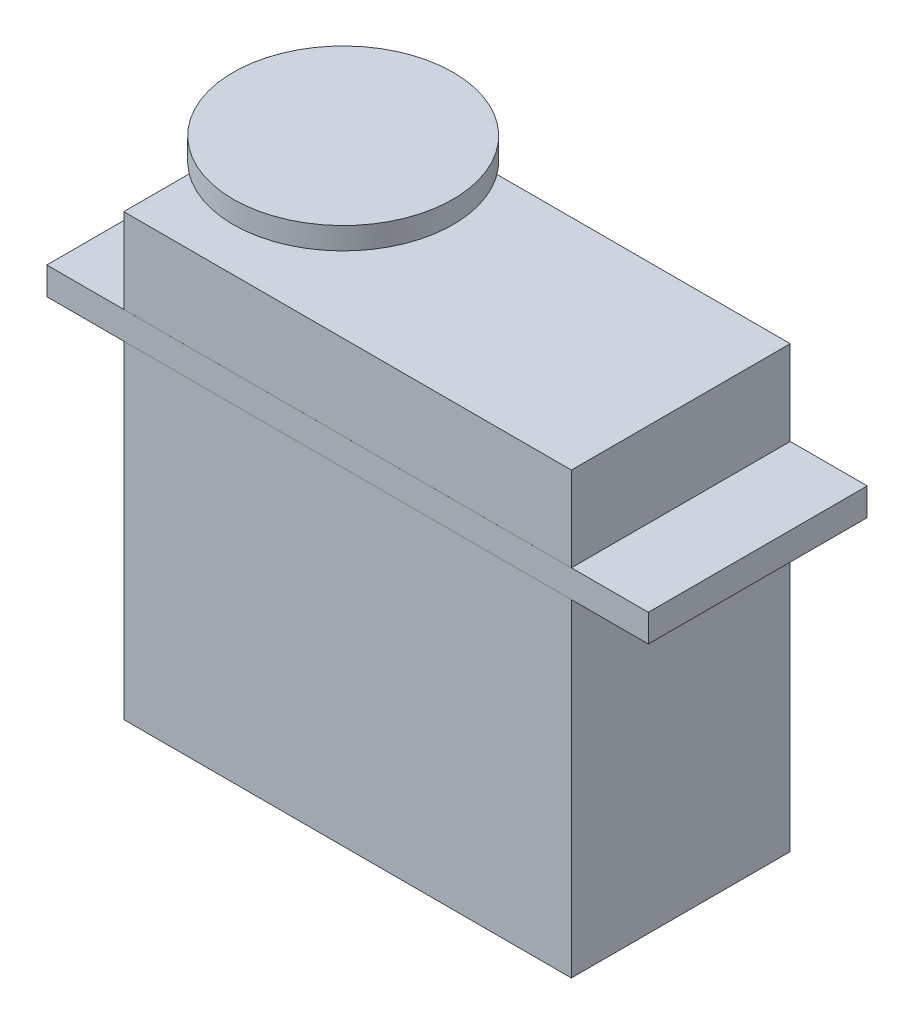
ISO-10303-21;
HEADER;
FILE_DESCRIPTION(('STEP AP214'),'2;1');
FILE_NAME('part.step','',(''),(''),'','','');
FILE_SCHEMA(('AUTOMOTIVE_DESIGN { 1 0 10303 214 1 1 1 1 }'));
ENDSEC;
DATA;
#1=APPLICATION_CONTEXT('core data for automotive mechanical design processes');
#2=APPLICATION_PROTOCOL_DEFINITION('international standard','automotive_design',2000,#1);
#3=PRODUCT_CONTEXT('',#1,'mechanical');
#4=PRODUCT('Part','Part','',(#3));
#5=PRODUCT_RELATED_PRODUCT_CATEGORY('part','',(#4));
#6=PRODUCT_DEFINITION_FORMATION('','',#4);
#7=PRODUCT_DEFINITION_CONTEXT('part definition',#1,'design');
#8=PRODUCT_DEFINITION('design','',#6,#7);
#9=PRODUCT_DEFINITION_SHAPE('','',#8);
#10=(LENGTH_UNIT() NAMED_UNIT(*) SI_UNIT(.MILLI.,.METRE.));
#11=(NAMED_UNIT(*) PLANE_ANGLE_UNIT() SI_UNIT($,.RADIAN.));
#12=(NAMED_UNIT(*) SI_UNIT($,.STERADIAN.) SOLID_ANGLE_UNIT());
#13=UNCERTAINTY_MEASURE_WITH_UNIT(LENGTH_MEASURE(1.E-05),#10,'distance_accuracy_value','');
#14=(GEOMETRIC_REPRESENTATION_CONTEXT(3) GLOBAL_UNCERTAINTY_ASSIGNED_CONTEXT((#13)) GLOBAL_UNIT_ASSIGNED_CONTEXT((#10,
#11,#12)) REPRESENTATION_CONTEXT('',''));
#15=CARTESIAN_POINT('',(0.,0.,0.));
#16=DIRECTION('',(0.,0.,1.));
#17=DIRECTION('',(1.,0.,0.));
#18=AXIS2_PLACEMENT_3D('',#15,#16,#17);
#19=CARTESIAN_POINT('',(-10.35,46.,0.));
#20=DIRECTION('',(0.,-1.,0.));
#21=DIRECTION('',(0.,0.,-1.));
#22=AXIS2_PLACEMENT_3D('',#19,#20,#21);
#23=CYLINDRICAL_SURFACE('',#22,3.);
#24=CARTESIAN_POINT('',(-10.35,40.,0.));
#25=DIRECTION('',(0.,1.,0.));
#26=DIRECTION('',(0.,0.,1.));
#27=AXIS2_PLACEMENT_3D('',#24,#25,#26);
#28=CIRCLE('',#27,3.);
#29=CARTESIAN_POINT('',(-10.35,40.,3.));
#30=VERTEX_POINT('',#29);
#31=EDGE_CURVE('E186',#30,#30,#28,.T.);
#32=ORIENTED_EDGE('',*,*,#31,.T.);
#33=EDGE_LOOP('',(#32));
#34=FACE_BOUND('',#33,.T.);
#35=CARTESIAN_POINT('',(-10.35,44.,0.));
#36=DIRECTION('',(0.,1.,0.));
#37=DIRECTION('',(0.,0.,1.));
#38=AXIS2_PLACEMENT_3D('',#35,#36,#37);
#39=CIRCLE('',#38,3.);
#40=CARTESIAN_POINT('',(-10.35,44.,3.));
#41=VERTEX_POINT('',#40);
#42=EDGE_CURVE('E11',#41,#41,#39,.T.);
#43=ORIENTED_EDGE('',*,*,#42,.F.);
#44=EDGE_LOOP('',(#43));
#45=FACE_BOUND('',#44,.T.);
#46=ADVANCED_FACE('F35',(#34,#45),#23,.T.);
#47=CARTESIAN_POINT('',(20.35,40.,-9.95));
#48=DIRECTION('',(-1.,0.,0.));
#49=DIRECTION('',(0.,0.,1.));
#50=AXIS2_PLACEMENT_3D('',#47,#48,#49);
#51=PLANE('',#50);
#52=DIRECTION('',(0.,-1.,0.));
#53=VECTOR('',#52,1.);
#54=CARTESIAN_POINT('',(20.35,40.,9.95));
#55=LINE('',#54,#53);
#56=CARTESIAN_POINT('',(20.35,40.,9.95));
#57=VERTEX_POINT('',#56);
#58=CARTESIAN_POINT('',(20.35,32.3,9.95));
#59=VERTEX_POINT('',#58);
#60=EDGE_CURVE('E211',#57,#59,#55,.T.);
#61=ORIENTED_EDGE('',*,*,#60,.T.);
#62=DIRECTION('',(0.,0.,-1.));
#63=VECTOR('',#62,1.);
#64=CARTESIAN_POINT('',(20.35,32.3,-9.95));
#65=LINE('',#64,#63);
#66=CARTESIAN_POINT('',(20.35,32.3,-9.95));
#67=VERTEX_POINT('',#66);
#68=EDGE_CURVE('E178',#59,#67,#65,.T.);
#69=ORIENTED_EDGE('',*,*,#68,.T.);
#70=DIRECTION('',(0.,-1.,0.));
#71=VECTOR('',#70,1.);
#72=CARTESIAN_POINT('',(20.35,40.,-9.95));
#73=LINE('',#72,#71);
#74=CARTESIAN_POINT('',(20.35,40.,-9.95));
#75=VERTEX_POINT('',#74);
#76=EDGE_CURVE('E223',#75,#67,#73,.T.);
#77=ORIENTED_EDGE('',*,*,#76,.F.);
#78=DIRECTION('',(0.,0.,-1.));
#79=VECTOR('',#78,1.);
#80=CARTESIAN_POINT('',(20.35,40.,-9.95));
#81=LINE('',#80,#79);
#82=EDGE_CURVE('E190',#57,#75,#81,.T.);
#83=ORIENTED_EDGE('',*,*,#82,.F.);
#84=EDGE_LOOP('',(#61,#69,#77,#83));
#85=FACE_BOUND('',#84,.T.);
#86=ADVANCED_FACE('F37',(#85),#51,.F.);
#87=CARTESIAN_POINT('',(-20.35,40.,-9.95));
#88=DIRECTION('',(0.,0.,1.));
#89=DIRECTION('',(1.,0.,0.));
#90=AXIS2_PLACEMENT_3D('',#87,#88,#89);
#91=PLANE('',#90);
#92=ORIENTED_EDGE('',*,*,#76,.T.);
#93=DIRECTION('',(-1.,0.,0.));
#94=VECTOR('',#93,1.);
#95=CARTESIAN_POINT('',(-20.35,32.3,-9.95));
#96=LINE('',#95,#94);
#97=CARTESIAN_POINT('',(-20.35,32.3,-9.95));
#98=VERTEX_POINT('',#97);
#99=EDGE_CURVE('E175',#67,#98,#96,.T.);
#100=ORIENTED_EDGE('',*,*,#99,.T.);
#101=DIRECTION('',(0.,-1.,0.));
#102=VECTOR('',#101,1.);
#103=CARTESIAN_POINT('',(-20.35,40.,-9.95));
#104=LINE('',#103,#102);
#105=CARTESIAN_POINT('',(-20.35,40.,-9.95));
#106=VERTEX_POINT('',#105);
#107=EDGE_CURVE('E219',#106,#98,#104,.T.);
#108=ORIENTED_EDGE('',*,*,#107,.F.);
#109=DIRECTION('',(-1.,0.,0.));
#110=VECTOR('',#109,1.);
#111=CARTESIAN_POINT('',(-20.35,40.,-9.95));
#112=LINE('',#111,#110);
#113=EDGE_CURVE('E193',#75,#106,#112,.T.);
#114=ORIENTED_EDGE('',*,*,#113,.F.);
#115=EDGE_LOOP('',(#92,#100,#108,#114));
#116=FACE_BOUND('',#115,.T.);
#117=ADVANCED_FACE('F243',(#116),#91,.F.);
#118=CARTESIAN_POINT('',(-20.35,40.,-9.95));
#119=DIRECTION('',(1.,0.,0.));
#120=DIRECTION('',(0.,0.,-1.));
#121=AXIS2_PLACEMENT_3D('',#118,#119,#120);
#122=PLANE('',#121);
#123=ORIENTED_EDGE('',*,*,#107,.T.);
#124=DIRECTION('',(0.,0.,1.));
#125=VECTOR('',#124,1.);
#126=CARTESIAN_POINT('',(-20.35,32.3,-9.95));
#127=LINE('',#126,#125);
#128=CARTESIAN_POINT('',(-20.35,32.3,9.95));
#129=VERTEX_POINT('',#128);
#130=EDGE_CURVE('E169',#98,#129,#127,.T.);
#131=ORIENTED_EDGE('',*,*,#130,.T.);
#132=DIRECTION('',(0.,-1.,0.));
#133=VECTOR('',#132,1.);
#134=CARTESIAN_POINT('',(-20.35,40.,9.95));
#135=LINE('',#134,#133);
#136=CARTESIAN_POINT('',(-20.35,40.,9.95));
#137=VERTEX_POINT('',#136);
#138=EDGE_CURVE('E215',#137,#129,#135,.T.);
#139=ORIENTED_EDGE('',*,*,#138,.F.);
#140=DIRECTION('',(0.,0.,1.));
#141=VECTOR('',#140,1.);
#142=CARTESIAN_POINT('',(-20.35,40.,-9.95));
#143=LINE('',#142,#141);
#144=EDGE_CURVE('E196',#106,#137,#143,.T.);
#145=ORIENTED_EDGE('',*,*,#144,.F.);
#146=EDGE_LOOP('',(#123,#131,#139,#145));
#147=FACE_BOUND('',#146,.T.);
#148=ADVANCED_FACE('F250',(#147),#122,.F.);
#149=CARTESIAN_POINT('',(-20.35,40.,9.95));
#150=DIRECTION('',(0.,0.,-1.));
#151=DIRECTION('',(-1.,0.,0.));
#152=AXIS2_PLACEMENT_3D('',#149,#150,#151);
#153=PLANE('',#152);
#154=ORIENTED_EDGE('',*,*,#138,.T.);
#155=DIRECTION('',(1.,0.,0.));
#156=VECTOR('',#155,1.);
#157=CARTESIAN_POINT('',(-20.35,32.3,9.95));
#158=LINE('',#157,#156);
#159=EDGE_CURVE('E226',#129,#59,#158,.T.);
#160=ORIENTED_EDGE('',*,*,#159,.T.);
#161=ORIENTED_EDGE('',*,*,#60,.F.);
#162=DIRECTION('',(1.,0.,0.));
#163=VECTOR('',#162,1.);
#164=CARTESIAN_POINT('',(-20.35,40.,9.95));
#165=LINE('',#164,#163);
#166=EDGE_CURVE('E198',#137,#57,#165,.T.);
#167=ORIENTED_EDGE('',*,*,#166,.F.);
#168=EDGE_LOOP('',(#154,#160,#161,#167));
#169=FACE_BOUND('',#168,.T.);
#170=ADVANCED_FACE('F268',(#169),#153,.F.);
#171=CARTESIAN_POINT('',(0.,40.,0.));
#172=DIRECTION('',(0.,1.,0.));
#173=DIRECTION('',(0.,0.,1.));
#174=AXIS2_PLACEMENT_3D('',#171,#172,#173);
#175=PLANE('',#174);
#176=ORIENTED_EDGE('',*,*,#31,.F.);
#177=EDGE_LOOP('',(#176));
#178=FACE_BOUND('',#177,.T.);
#179=ORIENTED_EDGE('',*,*,#82,.T.);
#180=ORIENTED_EDGE('',*,*,#113,.T.);
#181=ORIENTED_EDGE('',*,*,#144,.T.);
#182=ORIENTED_EDGE('',*,*,#166,.T.);
#183=EDGE_LOOP('',(#179,#180,#181,#182));
#184=FACE_BOUND('',#183,.T.);
#185=ADVANCED_FACE('F265',(#178,#184),#175,.T.);
#186=CARTESIAN_POINT('',(0.,29.8,0.));
#187=DIRECTION('',(0.,1.,0.));
#188=DIRECTION('',(0.,0.,1.));
#189=AXIS2_PLACEMENT_3D('',#186,#187,#188);
#190=PLANE('',#189);
#191=DIRECTION('',(0.,0.,1.));
#192=VECTOR('',#191,1.);
#193=CARTESIAN_POINT('',(-27.35,29.8,9.95061520725891));
#194=LINE('',#193,#192);
#195=CARTESIAN_POINT('',(-27.35,29.8,-9.95061520725891));
#196=VERTEX_POINT('',#195);
#197=CARTESIAN_POINT('',(-27.35,29.8,9.95061520725891));
#198=VERTEX_POINT('',#197);
#199=EDGE_CURVE('E144',#196,#198,#194,.T.);
#200=ORIENTED_EDGE('',*,*,#199,.F.);
#201=DIRECTION('',(-1.,0.,0.));
#202=VECTOR('',#201,1.);
#203=CARTESIAN_POINT('',(27.35,29.8,-9.95061520725891));
#204=LINE('',#203,#202);
#205=CARTESIAN_POINT('',(27.35,29.8,-9.95061520725891));
#206=VERTEX_POINT('',#205);
#207=EDGE_CURVE('E136',#206,#196,#204,.T.);
#208=ORIENTED_EDGE('',*,*,#207,.F.);
#209=DIRECTION('',(0.,0.,-1.));
#210=VECTOR('',#209,1.);
#211=CARTESIAN_POINT('',(27.35,29.8,9.95061520725891));
#212=LINE('',#211,#210);
#213=CARTESIAN_POINT('',(27.35,29.8,9.95061520725891));
#214=VERTEX_POINT('',#213);
#215=EDGE_CURVE('E147',#214,#206,#212,.T.);
#216=ORIENTED_EDGE('',*,*,#215,.F.);
#217=DIRECTION('',(1.,0.,0.));
#218=VECTOR('',#217,1.);
#219=CARTESIAN_POINT('',(27.35,29.8,9.95061520725891));
#220=LINE('',#219,#218);
#221=EDGE_CURVE('E128',#198,#214,#220,.T.);
#222=ORIENTED_EDGE('',*,*,#221,.F.);
#223=EDGE_LOOP('',(#200,#208,#216,#222));
#224=FACE_BOUND('',#223,.T.);
#225=DIRECTION('',(1.,0.,0.));
#226=VECTOR('',#225,1.);
#227=CARTESIAN_POINT('',(-20.35,29.8,9.95));
#228=LINE('',#227,#226);
#229=CARTESIAN_POINT('',(-20.35,29.8,9.95));
#230=VERTEX_POINT('',#229);
#231=CARTESIAN_POINT('',(20.35,29.8,9.95));
#232=VERTEX_POINT('',#231);
#233=EDGE_CURVE('E43',#230,#232,#228,.T.);
#234=ORIENTED_EDGE('',*,*,#233,.T.);
#235=DIRECTION('',(0.,0.,-1.));
#236=VECTOR('',#235,1.);
#237=CARTESIAN_POINT('',(20.35,29.8,-9.95));
#238=LINE('',#237,#236);
#239=CARTESIAN_POINT('',(20.35,29.8,-9.95));
#240=VERTEX_POINT('',#239);
#241=EDGE_CURVE('E183',#232,#240,#238,.T.);
#242=ORIENTED_EDGE('',*,*,#241,.T.);
#243=DIRECTION('',(-1.,0.,0.));
#244=VECTOR('',#243,1.);
#245=CARTESIAN_POINT('',(-20.35,29.8,-9.95));
#246=LINE('',#245,#244);
#247=CARTESIAN_POINT('',(-20.35,29.8,-9.95));
#248=VERTEX_POINT('',#247);
#249=EDGE_CURVE('E50',#240,#248,#246,.T.);
#250=ORIENTED_EDGE('',*,*,#249,.T.);
#251=DIRECTION('',(0.,0.,1.));
#252=VECTOR('',#251,1.);
#253=CARTESIAN_POINT('',(-20.35,29.8,-9.95));
#254=LINE('',#253,#252);
#255=EDGE_CURVE('E58',#248,#230,#254,.T.);
#256=ORIENTED_EDGE('',*,*,#255,.T.);
#257=EDGE_LOOP('',(#234,#242,#250,#256));
#258=FACE_BOUND('',#257,.T.);
#259=ADVANCED_FACE('F141',(#224,#258),#190,.F.);
#260=CARTESIAN_POINT('',(0.,32.3,0.));
#261=DIRECTION('',(0.,1.,0.));
#262=DIRECTION('',(0.,0.,1.));
#263=AXIS2_PLACEMENT_3D('',#260,#261,#262);
#264=PLANE('',#263);
#265=DIRECTION('',(0.,0.,1.));
#266=VECTOR('',#265,1.);
#267=CARTESIAN_POINT('',(-27.35,32.3,9.95061520725891));
#268=LINE('',#267,#266);
#269=CARTESIAN_POINT('',(-27.35,32.3,-9.95061520725891));
#270=VERTEX_POINT('',#269);
#271=CARTESIAN_POINT('',(-27.35,32.3,9.95061520725891));
#272=VERTEX_POINT('',#271);
#273=EDGE_CURVE('E162',#270,#272,#268,.T.);
#274=ORIENTED_EDGE('',*,*,#273,.T.);
#275=DIRECTION('',(1.,0.,0.));
#276=VECTOR('',#275,1.);
#277=CARTESIAN_POINT('',(27.35,32.3,9.95061520725891));
#278=LINE('',#277,#276);
#279=CARTESIAN_POINT('',(27.35,32.3,9.95061520725891));
#280=VERTEX_POINT('',#279);
#281=EDGE_CURVE('E130',#272,#280,#278,.T.);
#282=ORIENTED_EDGE('',*,*,#281,.T.);
#283=DIRECTION('',(0.,0.,-1.));
#284=VECTOR('',#283,1.);
#285=CARTESIAN_POINT('',(27.35,32.3,9.95061520725891));
#286=LINE('',#285,#284);
#287=CARTESIAN_POINT('',(27.35,32.3,-9.95061520725891));
#288=VERTEX_POINT('',#287);
#289=EDGE_CURVE('E154',#280,#288,#286,.T.);
#290=ORIENTED_EDGE('',*,*,#289,.T.);
#291=DIRECTION('',(-1.,0.,0.));
#292=VECTOR('',#291,1.);
#293=CARTESIAN_POINT('',(27.35,32.3,-9.95061520725891));
#294=LINE('',#293,#292);
#295=EDGE_CURVE('E151',#288,#270,#294,.T.);
#296=ORIENTED_EDGE('',*,*,#295,.T.);
#297=EDGE_LOOP('',(#274,#282,#290,#296));
#298=FACE_BOUND('',#297,.T.);
#299=ORIENTED_EDGE('',*,*,#68,.F.);
#300=ORIENTED_EDGE('',*,*,#159,.F.);
#301=ORIENTED_EDGE('',*,*,#130,.F.);
#302=ORIENTED_EDGE('',*,*,#99,.F.);
#303=EDGE_LOOP('',(#299,#300,#301,#302));
#304=FACE_BOUND('',#303,.T.);
#305=ADVANCED_FACE('F283',(#298,#304),#264,.T.);
#306=CARTESIAN_POINT('',(-27.35,29.8,9.95061520725891));
#307=DIRECTION('',(-1.,0.,0.));
#308=DIRECTION('',(0.,0.,1.));
#309=AXIS2_PLACEMENT_3D('',#306,#307,#308);
#310=PLANE('',#309);
#311=ORIENTED_EDGE('',*,*,#273,.F.);
#312=DIRECTION('',(0.,1.,0.));
#313=VECTOR('',#312,1.);
#314=CARTESIAN_POINT('',(-27.35,29.8,-9.95061520725891));
#315=LINE('',#314,#313);
#316=EDGE_CURVE('E150',#196,#270,#315,.T.);
#317=ORIENTED_EDGE('',*,*,#316,.F.);
#318=ORIENTED_EDGE('',*,*,#199,.T.);
#319=DIRECTION('',(0.,1.,0.));
#320=VECTOR('',#319,1.);
#321=CARTESIAN_POINT('',(-27.35,29.8,9.95061520725891));
#322=LINE('',#321,#320);
#323=EDGE_CURVE('E125',#198,#272,#322,.T.);
#324=ORIENTED_EDGE('',*,*,#323,.T.);
#325=EDGE_LOOP('',(#311,#317,#318,#324));
#326=FACE_BOUND('',#325,.T.);
#327=ADVANCED_FACE('F149',(#326),#310,.T.);
#328=CARTESIAN_POINT('',(27.35,29.8,-9.95061520725891));
#329=DIRECTION('',(0.,0.,-1.));
#330=DIRECTION('',(-1.,0.,0.));
#331=AXIS2_PLACEMENT_3D('',#328,#329,#330);
#332=PLANE('',#331);
#333=ORIENTED_EDGE('',*,*,#295,.F.);
#334=DIRECTION('',(0.,1.,0.));
#335=VECTOR('',#334,1.);
#336=CARTESIAN_POINT('',(27.35,29.8,-9.95061520725891));
#337=LINE('',#336,#335);
#338=EDGE_CURVE('E170',#206,#288,#337,.T.);
#339=ORIENTED_EDGE('',*,*,#338,.F.);
#340=ORIENTED_EDGE('',*,*,#207,.T.);
#341=ORIENTED_EDGE('',*,*,#316,.T.);
#342=EDGE_LOOP('',(#333,#339,#340,#341));
#343=FACE_BOUND('',#342,.T.);
#344=ADVANCED_FACE('F295',(#343),#332,.T.);
#345=CARTESIAN_POINT('',(27.35,29.8,9.95061520725891));
#346=DIRECTION('',(1.,0.,0.));
#347=DIRECTION('',(0.,0.,-1.));
#348=AXIS2_PLACEMENT_3D('',#345,#346,#347);
#349=PLANE('',#348);
#350=ORIENTED_EDGE('',*,*,#289,.F.);
#351=DIRECTION('',(0.,1.,0.));
#352=VECTOR('',#351,1.);
#353=CARTESIAN_POINT('',(27.35,29.8,9.95061520725891));
#354=LINE('',#353,#352);
#355=EDGE_CURVE('E135',#214,#280,#354,.T.);
#356=ORIENTED_EDGE('',*,*,#355,.F.);
#357=ORIENTED_EDGE('',*,*,#215,.T.);
#358=ORIENTED_EDGE('',*,*,#338,.T.);
#359=EDGE_LOOP('',(#350,#356,#357,#358));
#360=FACE_BOUND('',#359,.T.);
#361=ADVANCED_FACE('F301',(#360),#349,.T.);
#362=CARTESIAN_POINT('',(27.35,29.8,9.95061520725891));
#363=DIRECTION('',(0.,0.,1.));
#364=DIRECTION('',(1.,0.,0.));
#365=AXIS2_PLACEMENT_3D('',#362,#363,#364);
#366=PLANE('',#365);
#367=ORIENTED_EDGE('',*,*,#281,.F.);
#368=ORIENTED_EDGE('',*,*,#323,.F.);
#369=ORIENTED_EDGE('',*,*,#221,.T.);
#370=ORIENTED_EDGE('',*,*,#355,.T.);
#371=EDGE_LOOP('',(#367,#368,#369,#370));
#372=FACE_BOUND('',#371,.T.);
#373=ADVANCED_FACE('F127',(#372),#366,.T.);
#374=CARTESIAN_POINT('',(0.,0.,0.));
#375=DIRECTION('',(0.,1.,0.));
#376=DIRECTION('',(0.,0.,1.));
#377=AXIS2_PLACEMENT_3D('',#374,#375,#376);
#378=PLANE('',#377);
#379=DIRECTION('',(0.,0.,-1.));
#380=VECTOR('',#379,1.);
#381=CARTESIAN_POINT('',(20.35,0.,-9.95));
#382=LINE('',#381,#380);
#383=CARTESIAN_POINT('',(20.35,0.,9.95));
#384=VERTEX_POINT('',#383);
#385=CARTESIAN_POINT('',(20.35,0.,-9.95));
#386=VERTEX_POINT('',#385);
#387=EDGE_CURVE('E189',#384,#386,#382,.T.);
#388=ORIENTED_EDGE('',*,*,#387,.F.);
#389=DIRECTION('',(1.,0.,0.));
#390=VECTOR('',#389,1.);
#391=CARTESIAN_POINT('',(-20.35,0.,9.95));
#392=LINE('',#391,#390);
#393=CARTESIAN_POINT('',(-20.35,0.,9.95));
#394=VERTEX_POINT('',#393);
#395=EDGE_CURVE('E194',#394,#384,#392,.T.);
#396=ORIENTED_EDGE('',*,*,#395,.F.);
#397=DIRECTION('',(0.,0.,1.));
#398=VECTOR('',#397,1.);
#399=CARTESIAN_POINT('',(-20.35,0.,-9.95));
#400=LINE('',#399,#398);
#401=CARTESIAN_POINT('',(-20.35,0.,-9.95));
#402=VERTEX_POINT('',#401);
#403=EDGE_CURVE('E206',#402,#394,#400,.T.);
#404=ORIENTED_EDGE('',*,*,#403,.F.);
#405=DIRECTION('',(-1.,0.,0.));
#406=VECTOR('',#405,1.);
#407=CARTESIAN_POINT('',(-20.35,0.,-9.95));
#408=LINE('',#407,#406);
#409=EDGE_CURVE('E203',#386,#402,#408,.T.);
#410=ORIENTED_EDGE('',*,*,#409,.F.);
#411=EDGE_LOOP('',(#388,#396,#404,#410));
#412=FACE_BOUND('',#411,.T.);
#413=ADVANCED_FACE('F238',(#412),#378,.F.);
#414=ORIENTED_EDGE('',*,*,#233,.F.);
#415=EDGE_CURVE('E214',#230,#394,#135,.T.);
#416=ORIENTED_EDGE('',*,*,#415,.T.);
#417=ORIENTED_EDGE('',*,*,#395,.T.);
#418=EDGE_CURVE('E200',#232,#384,#55,.T.);
#419=ORIENTED_EDGE('',*,*,#418,.F.);
#420=EDGE_LOOP('',(#414,#416,#417,#419));
#421=FACE_BOUND('',#420,.T.);
#422=ADVANCED_FACE('F231',(#421),#153,.F.);
#423=ORIENTED_EDGE('',*,*,#255,.F.);
#424=EDGE_CURVE('E218',#248,#402,#104,.T.);
#425=ORIENTED_EDGE('',*,*,#424,.T.);
#426=ORIENTED_EDGE('',*,*,#403,.T.);
#427=ORIENTED_EDGE('',*,*,#415,.F.);
#428=EDGE_LOOP('',(#423,#425,#426,#427));
#429=FACE_BOUND('',#428,.T.);
#430=ADVANCED_FACE('F232',(#429),#122,.F.);
#431=ORIENTED_EDGE('',*,*,#249,.F.);
#432=EDGE_CURVE('E222',#240,#386,#73,.T.);
#433=ORIENTED_EDGE('',*,*,#432,.T.);
#434=ORIENTED_EDGE('',*,*,#409,.T.);
#435=ORIENTED_EDGE('',*,*,#424,.F.);
#436=EDGE_LOOP('',(#431,#433,#434,#435));
#437=FACE_BOUND('',#436,.T.);
#438=ADVANCED_FACE('F241',(#437),#91,.F.);
#439=ORIENTED_EDGE('',*,*,#241,.F.);
#440=ORIENTED_EDGE('',*,*,#418,.T.);
#441=ORIENTED_EDGE('',*,*,#387,.T.);
#442=ORIENTED_EDGE('',*,*,#432,.F.);
#443=EDGE_LOOP('',(#439,#440,#441,#442));
#444=FACE_BOUND('',#443,.T.);
#445=ADVANCED_FACE('F240',(#444),#51,.F.);
#446=CARTESIAN_POINT('',(-10.35,44.,0.));
#447=DIRECTION('',(0.,1.,0.));
#448=DIRECTION('',(0.,0.,1.));
#449=AXIS2_PLACEMENT_3D('',#446,#447,#448);
#450=CYLINDRICAL_SURFACE('',#449,10.);
#451=CARTESIAN_POINT('',(-10.35,44.,0.));
#452=DIRECTION('',(0.,1.,0.));
#453=DIRECTION('',(0.,0.,1.));
#454=AXIS2_PLACEMENT_3D('',#451,#452,#453);
#455=CIRCLE('',#454,10.);
#456=CARTESIAN_POINT('',(-10.35,44.,10.));
#457=VERTEX_POINT('',#456);
#458=EDGE_CURVE('E164',#457,#457,#455,.T.);
#459=ORIENTED_EDGE('',*,*,#458,.T.);
#460=EDGE_LOOP('',(#459));
#461=FACE_BOUND('',#460,.T.);
#462=CARTESIAN_POINT('',(-10.35,46.,0.));
#463=DIRECTION('',(0.,1.,0.));
#464=DIRECTION('',(0.,0.,1.));
#465=AXIS2_PLACEMENT_3D('',#462,#463,#464);
#466=CIRCLE('',#465,10.);
#467=CARTESIAN_POINT('',(-10.35,46.,10.));
#468=VERTEX_POINT('',#467);
#469=EDGE_CURVE('E157',#468,#468,#466,.T.);
#470=ORIENTED_EDGE('',*,*,#469,.F.);
#471=EDGE_LOOP('',(#470));
#472=FACE_BOUND('',#471,.T.);
#473=ADVANCED_FACE('F248',(#461,#472),#450,.T.);
#474=CARTESIAN_POINT('',(-10.35,44.,0.));
#475=DIRECTION('',(0.,1.,0.));
#476=DIRECTION('',(0.,0.,1.));
#477=AXIS2_PLACEMENT_3D('',#474,#475,#476);
#478=PLANE('',#477);
#479=ORIENTED_EDGE('',*,*,#42,.T.);
#480=EDGE_LOOP('',(#479));
#481=FACE_BOUND('',#480,.T.);
#482=ORIENTED_EDGE('',*,*,#458,.F.);
#483=EDGE_LOOP('',(#482));
#484=FACE_BOUND('',#483,.T.);
#485=ADVANCED_FACE('F349',(#481,#484),#478,.F.);
#486=CARTESIAN_POINT('',(-10.35,46.,0.));
#487=DIRECTION('',(0.,1.,0.));
#488=DIRECTION('',(0.,0.,1.));
#489=AXIS2_PLACEMENT_3D('',#486,#487,#488);
#490=PLANE('',#489);
#491=ORIENTED_EDGE('',*,*,#469,.T.);
#492=EDGE_LOOP('',(#491));
#493=FACE_BOUND('',#492,.T.);
#494=ADVANCED_FACE('F263',(#493),#490,.T.);
#495=CLOSED_SHELL('',(#46,#86,#117,#148,#170,#185,#259,#305,#327,#344,#361,#373,#413,#422,#430,
#438,#445,#473,#485,#494));
#496=MANIFOLD_SOLID_BREP('B2',#495);
#497=ADVANCED_BREP_SHAPE_REPRESENTATION('',(#18,#496),#14);
#498=SHAPE_DEFINITION_REPRESENTATION(#9,#497);
ENDSEC;
END-ISO-10303-21;
